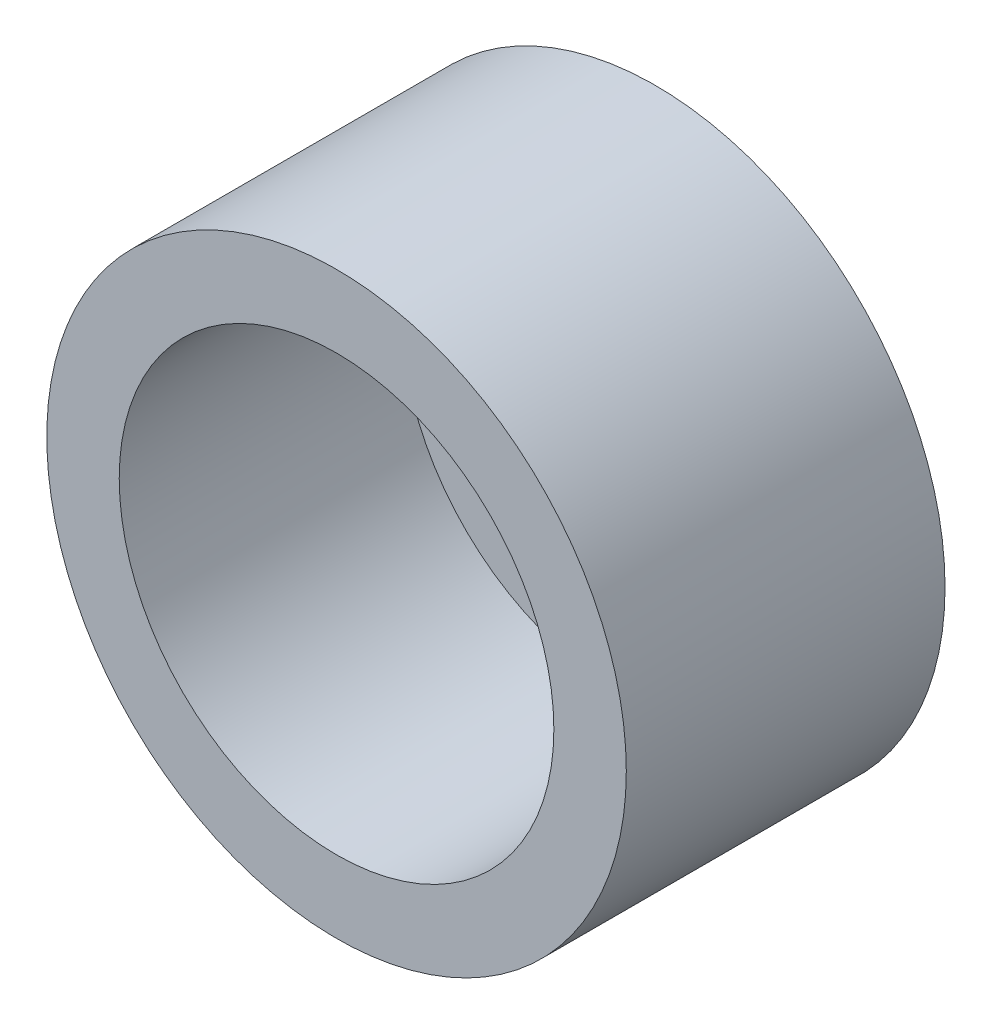
ISO-10303-21;
HEADER;
FILE_DESCRIPTION(('STEP AP214'),'2;1');
FILE_NAME('part.step','',(''),(''),'','','');
FILE_SCHEMA(('AUTOMOTIVE_DESIGN { 1 0 10303 214 1 1 1 1 }'));
ENDSEC;
DATA;
#1=APPLICATION_CONTEXT('core data for automotive mechanical design processes');
#2=APPLICATION_PROTOCOL_DEFINITION('international standard','automotive_design',2000,#1);
#3=PRODUCT_CONTEXT('',#1,'mechanical');
#4=PRODUCT('Part','Part','',(#3));
#5=PRODUCT_RELATED_PRODUCT_CATEGORY('part','',(#4));
#6=PRODUCT_DEFINITION_FORMATION('','',#4);
#7=PRODUCT_DEFINITION_CONTEXT('part definition',#1,'design');
#8=PRODUCT_DEFINITION('design','',#6,#7);
#9=PRODUCT_DEFINITION_SHAPE('','',#8);
#10=(LENGTH_UNIT() NAMED_UNIT(*) SI_UNIT(.MILLI.,.METRE.));
#11=(NAMED_UNIT(*) PLANE_ANGLE_UNIT() SI_UNIT($,.RADIAN.));
#12=(NAMED_UNIT(*) SI_UNIT($,.STERADIAN.) SOLID_ANGLE_UNIT());
#13=UNCERTAINTY_MEASURE_WITH_UNIT(LENGTH_MEASURE(1.E-05),#10,'distance_accuracy_value','');
#14=(GEOMETRIC_REPRESENTATION_CONTEXT(3) GLOBAL_UNCERTAINTY_ASSIGNED_CONTEXT((#13)) GLOBAL_UNIT_ASSIGNED_CONTEXT((#10,
#11,#12)) REPRESENTATION_CONTEXT('',''));
#15=CARTESIAN_POINT('',(0.,0.,0.));
#16=DIRECTION('',(0.,0.,1.));
#17=DIRECTION('',(1.,0.,0.));
#18=AXIS2_PLACEMENT_3D('',#15,#16,#17);
#19=CARTESIAN_POINT('',(0.,0.,22.));
#20=DIRECTION('',(0.,0.,-1.));
#21=DIRECTION('',(-1.,0.,0.));
#22=AXIS2_PLACEMENT_3D('',#19,#20,#21);
#23=CYLINDRICAL_SURFACE('',#22,15.);
#24=CARTESIAN_POINT('',(0.,0.,22.));
#25=DIRECTION('',(0.,0.,1.));
#26=DIRECTION('',(1.,0.,0.));
#27=AXIS2_PLACEMENT_3D('',#24,#25,#26);
#28=CIRCLE('',#27,15.);
#29=CARTESIAN_POINT('',(15.,0.,22.));
#30=VERTEX_POINT('',#29);
#31=EDGE_CURVE('E42',#30,#30,#28,.T.);
#32=ORIENTED_EDGE('',*,*,#31,.T.);
#33=EDGE_LOOP('',(#32));
#34=FACE_BOUND('',#33,.T.);
#35=CARTESIAN_POINT('',(0.,0.,2.5));
#36=DIRECTION('',(0.,0.,-1.));
#37=DIRECTION('',(-1.,0.,0.));
#38=AXIS2_PLACEMENT_3D('',#35,#36,#37);
#39=CIRCLE('',#38,15.);
#40=CARTESIAN_POINT('',(-15.,0.,2.5));
#41=VERTEX_POINT('',#40);
#42=EDGE_CURVE('E46',#41,#41,#39,.T.);
#43=ORIENTED_EDGE('',*,*,#42,.T.);
#44=EDGE_LOOP('',(#43));
#45=FACE_BOUND('',#44,.T.);
#46=ADVANCED_FACE('F31',(#34,#45),#23,.F.);
#47=CARTESIAN_POINT('',(0.,0.,22.));
#48=DIRECTION('',(0.,0.,1.));
#49=DIRECTION('',(1.,0.,0.));
#50=AXIS2_PLACEMENT_3D('',#47,#48,#49);
#51=PLANE('',#50);
#52=CARTESIAN_POINT('',(0.,0.,22.));
#53=DIRECTION('',(0.,0.,1.));
#54=DIRECTION('',(1.,0.,0.));
#55=AXIS2_PLACEMENT_3D('',#52,#53,#54);
#56=CIRCLE('',#55,20.);
#57=CARTESIAN_POINT('',(20.,0.,22.));
#58=VERTEX_POINT('',#57);
#59=EDGE_CURVE('E10',#58,#58,#56,.T.);
#60=ORIENTED_EDGE('',*,*,#59,.T.);
#61=EDGE_LOOP('',(#60));
#62=FACE_BOUND('',#61,.T.);
#63=ORIENTED_EDGE('',*,*,#31,.F.);
#64=EDGE_LOOP('',(#63));
#65=FACE_BOUND('',#64,.T.);
#66=ADVANCED_FACE('F68',(#62,#65),#51,.T.);
#67=CARTESIAN_POINT('',(0.,0.,0.));
#68=DIRECTION('',(0.,0.,1.));
#69=DIRECTION('',(1.,0.,0.));
#70=AXIS2_PLACEMENT_3D('',#67,#68,#69);
#71=PLANE('',#70);
#72=CARTESIAN_POINT('',(0.,0.,0.));
#73=DIRECTION('',(0.,0.,-1.));
#74=DIRECTION('',(-1.,0.,0.));
#75=AXIS2_PLACEMENT_3D('',#72,#73,#74);
#76=CIRCLE('',#75,4.25);
#77=CARTESIAN_POINT('',(-4.25,0.,0.));
#78=VERTEX_POINT('',#77);
#79=EDGE_CURVE('E50',#78,#78,#76,.T.);
#80=ORIENTED_EDGE('',*,*,#79,.F.);
#81=EDGE_LOOP('',(#80));
#82=FACE_BOUND('',#81,.T.);
#83=CARTESIAN_POINT('',(0.,0.,0.));
#84=DIRECTION('',(0.,0.,1.));
#85=DIRECTION('',(1.,0.,0.));
#86=AXIS2_PLACEMENT_3D('',#83,#84,#85);
#87=CIRCLE('',#86,20.);
#88=CARTESIAN_POINT('',(20.,0.,0.));
#89=VERTEX_POINT('',#88);
#90=EDGE_CURVE('E35',#89,#89,#87,.T.);
#91=ORIENTED_EDGE('',*,*,#90,.F.);
#92=EDGE_LOOP('',(#91));
#93=FACE_BOUND('',#92,.T.);
#94=ADVANCED_FACE('F65',(#82,#93),#71,.F.);
#95=CARTESIAN_POINT('',(0.,0.,22.));
#96=DIRECTION('',(0.,0.,-1.));
#97=DIRECTION('',(-1.,0.,0.));
#98=AXIS2_PLACEMENT_3D('',#95,#96,#97);
#99=CYLINDRICAL_SURFACE('',#98,20.);
#100=ORIENTED_EDGE('',*,*,#59,.F.);
#101=EDGE_LOOP('',(#100));
#102=FACE_BOUND('',#101,.T.);
#103=ORIENTED_EDGE('',*,*,#90,.T.);
#104=EDGE_LOOP('',(#103));
#105=FACE_BOUND('',#104,.T.);
#106=ADVANCED_FACE('F33',(#102,#105),#99,.T.);
#107=CARTESIAN_POINT('',(0.,0.,2.5));
#108=DIRECTION('',(0.,0.,-1.));
#109=DIRECTION('',(-1.,0.,0.));
#110=AXIS2_PLACEMENT_3D('',#107,#108,#109);
#111=PLANE('',#110);
#112=CARTESIAN_POINT('',(0.,0.,2.5));
#113=DIRECTION('',(0.,0.,-1.));
#114=DIRECTION('',(-1.,0.,0.));
#115=AXIS2_PLACEMENT_3D('',#112,#113,#114);
#116=CIRCLE('',#115,4.25);
#117=CARTESIAN_POINT('',(-4.25,0.,2.5));
#118=VERTEX_POINT('',#117);
#119=EDGE_CURVE('E49',#118,#118,#116,.T.);
#120=ORIENTED_EDGE('',*,*,#119,.T.);
#121=EDGE_LOOP('',(#120));
#122=FACE_BOUND('',#121,.T.);
#123=ORIENTED_EDGE('',*,*,#42,.F.);
#124=EDGE_LOOP('',(#123));
#125=FACE_BOUND('',#124,.T.);
#126=ADVANCED_FACE('F56',(#122,#125),#111,.F.);
#127=CARTESIAN_POINT('',(0.,0.,2.5));
#128=DIRECTION('',(0.,0.,-1.));
#129=DIRECTION('',(-1.,0.,0.));
#130=AXIS2_PLACEMENT_3D('',#127,#128,#129);
#131=CYLINDRICAL_SURFACE('',#130,4.25);
#132=ORIENTED_EDGE('',*,*,#119,.F.);
#133=EDGE_LOOP('',(#132));
#134=FACE_BOUND('',#133,.T.);
#135=ORIENTED_EDGE('',*,*,#79,.T.);
#136=EDGE_LOOP('',(#135));
#137=FACE_BOUND('',#136,.T.);
#138=ADVANCED_FACE('F59',(#134,#137),#131,.F.);
#139=CLOSED_SHELL('',(#46,#66,#94,#106,#126,#138));
#140=MANIFOLD_SOLID_BREP('B2',#139);
#141=ADVANCED_BREP_SHAPE_REPRESENTATION('',(#18,#140),#14);
#142=SHAPE_DEFINITION_REPRESENTATION(#9,#141);
ENDSEC;
END-ISO-10303-21;
